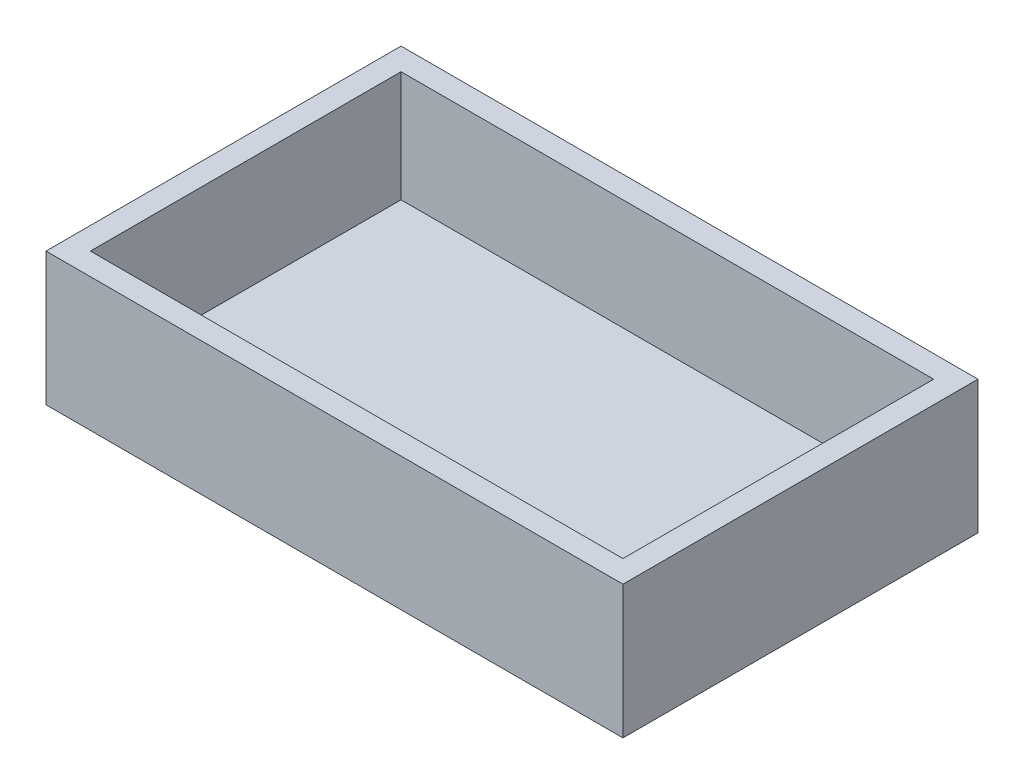
ISO-10303-21;
HEADER;
FILE_DESCRIPTION(('STEP AP214'),'2;1');
FILE_NAME('part.step','',(''),(''),'','','');
FILE_SCHEMA(('AUTOMOTIVE_DESIGN { 1 0 10303 214 1 1 1 1 }'));
ENDSEC;
DATA;
#1=APPLICATION_CONTEXT('core data for automotive mechanical design processes');
#2=APPLICATION_PROTOCOL_DEFINITION('international standard','automotive_design',2000,#1);
#3=PRODUCT_CONTEXT('',#1,'mechanical');
#4=PRODUCT('Part','Part','',(#3));
#5=PRODUCT_RELATED_PRODUCT_CATEGORY('part','',(#4));
#6=PRODUCT_DEFINITION_FORMATION('','',#4);
#7=PRODUCT_DEFINITION_CONTEXT('part definition',#1,'design');
#8=PRODUCT_DEFINITION('design','',#6,#7);
#9=PRODUCT_DEFINITION_SHAPE('','',#8);
#10=(LENGTH_UNIT() NAMED_UNIT(*) SI_UNIT(.MILLI.,.METRE.));
#11=(NAMED_UNIT(*) PLANE_ANGLE_UNIT() SI_UNIT($,.RADIAN.));
#12=(NAMED_UNIT(*) SI_UNIT($,.STERADIAN.) SOLID_ANGLE_UNIT());
#13=UNCERTAINTY_MEASURE_WITH_UNIT(LENGTH_MEASURE(1.E-05),#10,'distance_accuracy_value','');
#14=(GEOMETRIC_REPRESENTATION_CONTEXT(3) GLOBAL_UNCERTAINTY_ASSIGNED_CONTEXT((#13)) GLOBAL_UNIT_ASSIGNED_CONTEXT((#10,
#11,#12)) REPRESENTATION_CONTEXT('',''));
#15=CARTESIAN_POINT('',(0.,0.,0.));
#16=DIRECTION('',(0.,0.,1.));
#17=DIRECTION('',(1.,0.,0.));
#18=AXIS2_PLACEMENT_3D('',#15,#16,#17);
#19=CARTESIAN_POINT('',(65.,5.,-40.));
#20=DIRECTION('',(-1.,0.,0.));
#21=DIRECTION('',(0.,0.,1.));
#22=AXIS2_PLACEMENT_3D('',#19,#20,#21);
#23=PLANE('',#22);
#24=DIRECTION('',(0.,0.,-1.));
#25=VECTOR('',#24,1.);
#26=CARTESIAN_POINT('',(65.,0.,-40.));
#27=LINE('',#26,#25);
#28=CARTESIAN_POINT('',(65.,0.,40.));
#29=VERTEX_POINT('',#28);
#30=CARTESIAN_POINT('',(65.,0.,-40.));
#31=VERTEX_POINT('',#30);
#32=EDGE_CURVE('E144',#29,#31,#27,.T.);
#33=ORIENTED_EDGE('',*,*,#32,.T.);
#34=DIRECTION('',(0.,-1.,0.));
#35=VECTOR('',#34,1.);
#36=CARTESIAN_POINT('',(65.,5.,-40.));
#37=LINE('',#36,#35);
#38=CARTESIAN_POINT('',(65.,30.,-40.));
#39=VERTEX_POINT('',#38);
#40=EDGE_CURVE('E11',#39,#31,#37,.T.);
#41=ORIENTED_EDGE('',*,*,#40,.F.);
#42=DIRECTION('',(0.,0.,-1.));
#43=VECTOR('',#42,1.);
#44=CARTESIAN_POINT('',(65.,30.,40.));
#45=LINE('',#44,#43);
#46=CARTESIAN_POINT('',(65.,30.,40.));
#47=VERTEX_POINT('',#46);
#48=EDGE_CURVE('E138',#47,#39,#45,.T.);
#49=ORIENTED_EDGE('',*,*,#48,.F.);
#50=DIRECTION('',(0.,-1.,0.));
#51=VECTOR('',#50,1.);
#52=CARTESIAN_POINT('',(65.,5.,40.));
#53=LINE('',#52,#51);
#54=EDGE_CURVE('E153',#47,#29,#53,.T.);
#55=ORIENTED_EDGE('',*,*,#54,.T.);
#56=EDGE_LOOP('',(#33,#41,#49,#55));
#57=FACE_BOUND('',#56,.T.);
#58=ADVANCED_FACE('F33',(#57),#23,.F.);
#59=CARTESIAN_POINT('',(-65.,5.,-40.));
#60=DIRECTION('',(0.,0.,1.));
#61=DIRECTION('',(1.,0.,0.));
#62=AXIS2_PLACEMENT_3D('',#59,#60,#61);
#63=PLANE('',#62);
#64=DIRECTION('',(-1.,0.,0.));
#65=VECTOR('',#64,1.);
#66=CARTESIAN_POINT('',(-65.,0.,-40.));
#67=LINE('',#66,#65);
#68=CARTESIAN_POINT('',(-65.,0.,-40.));
#69=VERTEX_POINT('',#68);
#70=EDGE_CURVE('E147',#31,#69,#67,.T.);
#71=ORIENTED_EDGE('',*,*,#70,.T.);
#72=DIRECTION('',(0.,-1.,0.));
#73=VECTOR('',#72,1.);
#74=CARTESIAN_POINT('',(-65.,5.,-40.));
#75=LINE('',#74,#73);
#76=CARTESIAN_POINT('',(-65.,30.,-40.));
#77=VERTEX_POINT('',#76);
#78=EDGE_CURVE('E40',#77,#69,#75,.T.);
#79=ORIENTED_EDGE('',*,*,#78,.F.);
#80=DIRECTION('',(-1.,0.,0.));
#81=VECTOR('',#80,1.);
#82=CARTESIAN_POINT('',(65.,30.,-40.));
#83=LINE('',#82,#81);
#84=EDGE_CURVE('E141',#39,#77,#83,.T.);
#85=ORIENTED_EDGE('',*,*,#84,.F.);
#86=ORIENTED_EDGE('',*,*,#40,.T.);
#87=EDGE_LOOP('',(#71,#79,#85,#86));
#88=FACE_BOUND('',#87,.T.);
#89=ADVANCED_FACE('F175',(#88),#63,.F.);
#90=CARTESIAN_POINT('',(-65.,5.,-40.));
#91=DIRECTION('',(1.,0.,0.));
#92=DIRECTION('',(0.,0.,-1.));
#93=AXIS2_PLACEMENT_3D('',#90,#91,#92);
#94=PLANE('',#93);
#95=DIRECTION('',(0.,0.,1.));
#96=VECTOR('',#95,1.);
#97=CARTESIAN_POINT('',(-65.,0.,-40.));
#98=LINE('',#97,#96);
#99=CARTESIAN_POINT('',(-65.,0.,40.));
#100=VERTEX_POINT('',#99);
#101=EDGE_CURVE('E149',#69,#100,#98,.T.);
#102=ORIENTED_EDGE('',*,*,#101,.T.);
#103=DIRECTION('',(0.,-1.,0.));
#104=VECTOR('',#103,1.);
#105=CARTESIAN_POINT('',(-65.,5.,40.));
#106=LINE('',#105,#104);
#107=CARTESIAN_POINT('',(-65.,30.,40.));
#108=VERTEX_POINT('',#107);
#109=EDGE_CURVE('E156',#108,#100,#106,.T.);
#110=ORIENTED_EDGE('',*,*,#109,.F.);
#111=DIRECTION('',(0.,0.,1.));
#112=VECTOR('',#111,1.);
#113=CARTESIAN_POINT('',(-65.,30.,40.));
#114=LINE('',#113,#112);
#115=EDGE_CURVE('E111',#77,#108,#114,.T.);
#116=ORIENTED_EDGE('',*,*,#115,.F.);
#117=ORIENTED_EDGE('',*,*,#78,.T.);
#118=EDGE_LOOP('',(#102,#110,#116,#117));
#119=FACE_BOUND('',#118,.T.);
#120=ADVANCED_FACE('F162',(#119),#94,.F.);
#121=CARTESIAN_POINT('',(-65.,5.,40.));
#122=DIRECTION('',(0.,0.,-1.));
#123=DIRECTION('',(-1.,0.,0.));
#124=AXIS2_PLACEMENT_3D('',#121,#122,#123);
#125=PLANE('',#124);
#126=DIRECTION('',(1.,0.,0.));
#127=VECTOR('',#126,1.);
#128=CARTESIAN_POINT('',(-65.,0.,40.));
#129=LINE('',#128,#127);
#130=EDGE_CURVE('E151',#100,#29,#129,.T.);
#131=ORIENTED_EDGE('',*,*,#130,.T.);
#132=ORIENTED_EDGE('',*,*,#54,.F.);
#133=DIRECTION('',(1.,0.,0.));
#134=VECTOR('',#133,1.);
#135=CARTESIAN_POINT('',(65.,30.,40.));
#136=LINE('',#135,#134);
#137=EDGE_CURVE('E135',#108,#47,#136,.T.);
#138=ORIENTED_EDGE('',*,*,#137,.F.);
#139=ORIENTED_EDGE('',*,*,#109,.T.);
#140=EDGE_LOOP('',(#131,#132,#138,#139));
#141=FACE_BOUND('',#140,.T.);
#142=ADVANCED_FACE('F170',(#141),#125,.F.);
#143=CARTESIAN_POINT('',(0.,0.,0.));
#144=DIRECTION('',(0.,1.,0.));
#145=DIRECTION('',(0.,0.,1.));
#146=AXIS2_PLACEMENT_3D('',#143,#144,#145);
#147=PLANE('',#146);
#148=ORIENTED_EDGE('',*,*,#32,.F.);
#149=ORIENTED_EDGE('',*,*,#130,.F.);
#150=ORIENTED_EDGE('',*,*,#101,.F.);
#151=ORIENTED_EDGE('',*,*,#70,.F.);
#152=EDGE_LOOP('',(#148,#149,#150,#151));
#153=FACE_BOUND('',#152,.T.);
#154=ADVANCED_FACE('F168',(#153),#147,.F.);
#155=CARTESIAN_POINT('',(0.,30.,0.));
#156=DIRECTION('',(0.,1.,0.));
#157=DIRECTION('',(0.,0.,1.));
#158=AXIS2_PLACEMENT_3D('',#155,#156,#157);
#159=PLANE('',#158);
#160=ORIENTED_EDGE('',*,*,#115,.T.);
#161=ORIENTED_EDGE('',*,*,#137,.T.);
#162=ORIENTED_EDGE('',*,*,#48,.T.);
#163=ORIENTED_EDGE('',*,*,#84,.T.);
#164=EDGE_LOOP('',(#160,#161,#162,#163));
#165=FACE_BOUND('',#164,.T.);
#166=DIRECTION('',(1.,0.,0.));
#167=VECTOR('',#166,1.);
#168=CARTESIAN_POINT('',(60.,30.,35.));
#169=LINE('',#168,#167);
#170=CARTESIAN_POINT('',(-60.,30.,35.));
#171=VERTEX_POINT('',#170);
#172=CARTESIAN_POINT('',(60.,30.,35.));
#173=VERTEX_POINT('',#172);
#174=EDGE_CURVE('E105',#171,#173,#169,.T.);
#175=ORIENTED_EDGE('',*,*,#174,.F.);
#176=DIRECTION('',(0.,0.,1.));
#177=VECTOR('',#176,1.);
#178=CARTESIAN_POINT('',(-60.,30.,35.));
#179=LINE('',#178,#177);
#180=CARTESIAN_POINT('',(-60.,30.,-35.));
#181=VERTEX_POINT('',#180);
#182=EDGE_CURVE('E96',#181,#171,#179,.T.);
#183=ORIENTED_EDGE('',*,*,#182,.F.);
#184=DIRECTION('',(-1.,0.,0.));
#185=VECTOR('',#184,1.);
#186=CARTESIAN_POINT('',(60.,30.,-35.));
#187=LINE('',#186,#185);
#188=CARTESIAN_POINT('',(60.,30.,-35.));
#189=VERTEX_POINT('',#188);
#190=EDGE_CURVE('E119',#189,#181,#187,.T.);
#191=ORIENTED_EDGE('',*,*,#190,.F.);
#192=DIRECTION('',(0.,0.,-1.));
#193=VECTOR('',#192,1.);
#194=CARTESIAN_POINT('',(60.,30.,35.));
#195=LINE('',#194,#193);
#196=EDGE_CURVE('E117',#173,#189,#195,.T.);
#197=ORIENTED_EDGE('',*,*,#196,.F.);
#198=EDGE_LOOP('',(#175,#183,#191,#197));
#199=FACE_BOUND('',#198,.T.);
#200=ADVANCED_FACE('F115',(#165,#199),#159,.T.);
#201=CARTESIAN_POINT('',(-60.,30.,35.));
#202=DIRECTION('',(1.,0.,0.));
#203=DIRECTION('',(0.,0.,-1.));
#204=AXIS2_PLACEMENT_3D('',#201,#202,#203);
#205=PLANE('',#204);
#206=DIRECTION('',(0.,0.,1.));
#207=VECTOR('',#206,1.);
#208=CARTESIAN_POINT('',(-60.,5.,35.));
#209=LINE('',#208,#207);
#210=CARTESIAN_POINT('',(-60.,5.,-35.));
#211=VERTEX_POINT('',#210);
#212=CARTESIAN_POINT('',(-60.,5.,35.));
#213=VERTEX_POINT('',#212);
#214=EDGE_CURVE('E47',#211,#213,#209,.T.);
#215=ORIENTED_EDGE('',*,*,#214,.F.);
#216=DIRECTION('',(0.,-1.,0.));
#217=VECTOR('',#216,1.);
#218=CARTESIAN_POINT('',(-60.,30.,-35.));
#219=LINE('',#218,#217);
#220=EDGE_CURVE('E101',#181,#211,#219,.T.);
#221=ORIENTED_EDGE('',*,*,#220,.F.);
#222=ORIENTED_EDGE('',*,*,#182,.T.);
#223=DIRECTION('',(0.,-1.,0.));
#224=VECTOR('',#223,1.);
#225=CARTESIAN_POINT('',(-60.,30.,35.));
#226=LINE('',#225,#224);
#227=EDGE_CURVE('E99',#171,#213,#226,.T.);
#228=ORIENTED_EDGE('',*,*,#227,.T.);
#229=EDGE_LOOP('',(#215,#221,#222,#228));
#230=FACE_BOUND('',#229,.T.);
#231=ADVANCED_FACE('F98',(#230),#205,.T.);
#232=CARTESIAN_POINT('',(60.,30.,35.));
#233=DIRECTION('',(0.,0.,-1.));
#234=DIRECTION('',(-1.,0.,0.));
#235=AXIS2_PLACEMENT_3D('',#232,#233,#234);
#236=PLANE('',#235);
#237=DIRECTION('',(1.,0.,0.));
#238=VECTOR('',#237,1.);
#239=CARTESIAN_POINT('',(60.,5.,35.));
#240=LINE('',#239,#238);
#241=CARTESIAN_POINT('',(60.,5.,35.));
#242=VERTEX_POINT('',#241);
#243=EDGE_CURVE('E51',#213,#242,#240,.T.);
#244=ORIENTED_EDGE('',*,*,#243,.F.);
#245=ORIENTED_EDGE('',*,*,#227,.F.);
#246=ORIENTED_EDGE('',*,*,#174,.T.);
#247=DIRECTION('',(0.,-1.,0.));
#248=VECTOR('',#247,1.);
#249=CARTESIAN_POINT('',(60.,30.,35.));
#250=LINE('',#249,#248);
#251=EDGE_CURVE('E112',#173,#242,#250,.T.);
#252=ORIENTED_EDGE('',*,*,#251,.T.);
#253=EDGE_LOOP('',(#244,#245,#246,#252));
#254=FACE_BOUND('',#253,.T.);
#255=ADVANCED_FACE('F109',(#254),#236,.T.);
#256=CARTESIAN_POINT('',(60.,30.,35.));
#257=DIRECTION('',(-1.,0.,0.));
#258=DIRECTION('',(0.,0.,1.));
#259=AXIS2_PLACEMENT_3D('',#256,#257,#258);
#260=PLANE('',#259);
#261=DIRECTION('',(0.,0.,-1.));
#262=VECTOR('',#261,1.);
#263=CARTESIAN_POINT('',(60.,5.,35.));
#264=LINE('',#263,#262);
#265=CARTESIAN_POINT('',(60.,5.,-35.));
#266=VERTEX_POINT('',#265);
#267=EDGE_CURVE('E125',#242,#266,#264,.T.);
#268=ORIENTED_EDGE('',*,*,#267,.F.);
#269=ORIENTED_EDGE('',*,*,#251,.F.);
#270=ORIENTED_EDGE('',*,*,#196,.T.);
#271=DIRECTION('',(0.,-1.,0.));
#272=VECTOR('',#271,1.);
#273=CARTESIAN_POINT('',(60.,30.,-35.));
#274=LINE('',#273,#272);
#275=EDGE_CURVE('E129',#189,#266,#274,.T.);
#276=ORIENTED_EDGE('',*,*,#275,.T.);
#277=EDGE_LOOP('',(#268,#269,#270,#276));
#278=FACE_BOUND('',#277,.T.);
#279=ADVANCED_FACE('F197',(#278),#260,.T.);
#280=CARTESIAN_POINT('',(60.,30.,-35.));
#281=DIRECTION('',(0.,0.,1.));
#282=DIRECTION('',(1.,0.,0.));
#283=AXIS2_PLACEMENT_3D('',#280,#281,#282);
#284=PLANE('',#283);
#285=DIRECTION('',(-1.,0.,0.));
#286=VECTOR('',#285,1.);
#287=CARTESIAN_POINT('',(60.,5.,-35.));
#288=LINE('',#287,#286);
#289=EDGE_CURVE('E106',#266,#211,#288,.T.);
#290=ORIENTED_EDGE('',*,*,#289,.F.);
#291=ORIENTED_EDGE('',*,*,#275,.F.);
#292=ORIENTED_EDGE('',*,*,#190,.T.);
#293=ORIENTED_EDGE('',*,*,#220,.T.);
#294=EDGE_LOOP('',(#290,#291,#292,#293));
#295=FACE_BOUND('',#294,.T.);
#296=ADVANCED_FACE('F190',(#295),#284,.T.);
#297=CARTESIAN_POINT('',(0.,5.,0.));
#298=DIRECTION('',(0.,1.,0.));
#299=DIRECTION('',(0.,0.,1.));
#300=AXIS2_PLACEMENT_3D('',#297,#298,#299);
#301=PLANE('',#300);
#302=ORIENTED_EDGE('',*,*,#214,.T.);
#303=ORIENTED_EDGE('',*,*,#243,.T.);
#304=ORIENTED_EDGE('',*,*,#267,.T.);
#305=ORIENTED_EDGE('',*,*,#289,.T.);
#306=EDGE_LOOP('',(#302,#303,#304,#305));
#307=FACE_BOUND('',#306,.T.);
#308=ADVANCED_FACE('F187',(#307),#301,.T.);
#309=CLOSED_SHELL('',(#58,#89,#120,#142,#154,#200,#231,#255,#279,#296,#308));
#310=MANIFOLD_SOLID_BREP('B2',#309);
#311=ADVANCED_BREP_SHAPE_REPRESENTATION('',(#18,#310),#14);
#312=SHAPE_DEFINITION_REPRESENTATION(#9,#311);
ENDSEC;
END-ISO-10303-21;
